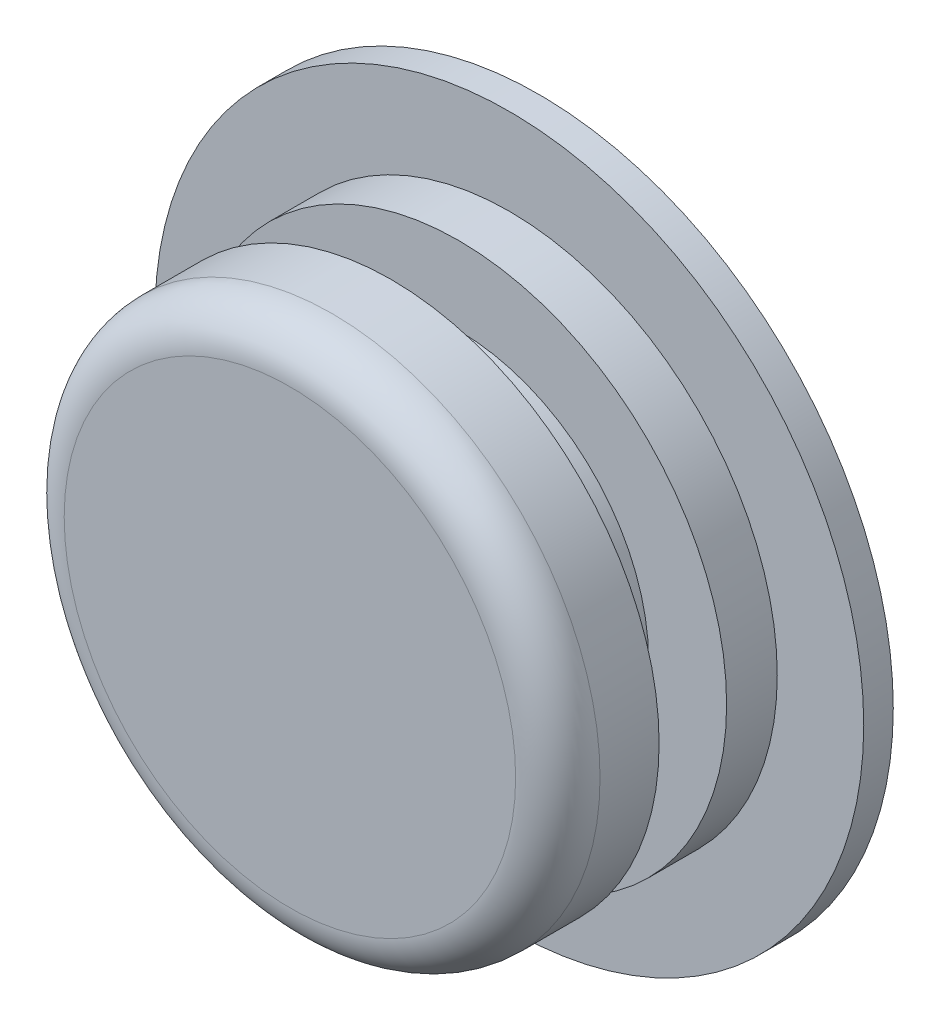
ISO-10303-21;
HEADER;
FILE_DESCRIPTION(('STEP AP214'),'2;1');
FILE_NAME('part.step','',(''),(''),'','','');
FILE_SCHEMA(('AUTOMOTIVE_DESIGN { 1 0 10303 214 1 1 1 1 }'));
ENDSEC;
DATA;
#1=APPLICATION_CONTEXT('core data for automotive mechanical design processes');
#2=APPLICATION_PROTOCOL_DEFINITION('international standard','automotive_design',2000,#1);
#3=PRODUCT_CONTEXT('',#1,'mechanical');
#4=PRODUCT('Part','Part','',(#3));
#5=PRODUCT_RELATED_PRODUCT_CATEGORY('part','',(#4));
#6=PRODUCT_DEFINITION_FORMATION('','',#4);
#7=PRODUCT_DEFINITION_CONTEXT('part definition',#1,'design');
#8=PRODUCT_DEFINITION('design','',#6,#7);
#9=PRODUCT_DEFINITION_SHAPE('','',#8);
#10=(LENGTH_UNIT() NAMED_UNIT(*) SI_UNIT(.MILLI.,.METRE.));
#11=(NAMED_UNIT(*) PLANE_ANGLE_UNIT() SI_UNIT($,.RADIAN.));
#12=(NAMED_UNIT(*) SI_UNIT($,.STERADIAN.) SOLID_ANGLE_UNIT());
#13=UNCERTAINTY_MEASURE_WITH_UNIT(LENGTH_MEASURE(1.E-05),#10,'distance_accuracy_value','');
#14=(GEOMETRIC_REPRESENTATION_CONTEXT(3) GLOBAL_UNCERTAINTY_ASSIGNED_CONTEXT((#13)) GLOBAL_UNIT_ASSIGNED_CONTEXT((#10,
#11,#12)) REPRESENTATION_CONTEXT('',''));
#15=CARTESIAN_POINT('',(0.,0.,0.));
#16=DIRECTION('',(0.,0.,1.));
#17=DIRECTION('',(1.,0.,0.));
#18=AXIS2_PLACEMENT_3D('',#15,#16,#17);
#19=CARTESIAN_POINT('',(0.,0.,29.5));
#20=DIRECTION('',(0.,0.,-1.));
#21=DIRECTION('',(-1.,0.,0.));
#22=AXIS2_PLACEMENT_3D('',#19,#20,#21);
#23=CYLINDRICAL_SURFACE('',#22,31.75);
#24=CARTESIAN_POINT('',(0.,0.,24.5));
#25=DIRECTION('',(0.,0.,1.));
#26=DIRECTION('',(1.,0.,0.));
#27=AXIS2_PLACEMENT_3D('',#24,#25,#26);
#28=CIRCLE('',#27,31.75);
#29=CARTESIAN_POINT('',(31.75,0.,24.5));
#30=VERTEX_POINT('',#29);
#31=EDGE_CURVE('E11',#30,#30,#28,.F.);
#32=ORIENTED_EDGE('',*,*,#31,.T.);
#33=EDGE_LOOP('',(#32));
#34=FACE_BOUND('',#33,.T.);
#35=CARTESIAN_POINT('',(0.,0.,17.5));
#36=DIRECTION('',(0.,0.,1.));
#37=DIRECTION('',(1.,0.,0.));
#38=AXIS2_PLACEMENT_3D('',#35,#36,#37);
#39=CIRCLE('',#38,31.75);
#40=CARTESIAN_POINT('',(31.75,0.,17.5));
#41=VERTEX_POINT('',#40);
#42=EDGE_CURVE('E53',#41,#41,#39,.T.);
#43=ORIENTED_EDGE('',*,*,#42,.T.);
#44=EDGE_LOOP('',(#43));
#45=FACE_BOUND('',#44,.T.);
#46=ADVANCED_FACE('F42',(#34,#45),#23,.T.);
#47=CARTESIAN_POINT('',(0.,0.,29.5));
#48=DIRECTION('',(0.,0.,1.));
#49=DIRECTION('',(1.,0.,0.));
#50=AXIS2_PLACEMENT_3D('',#47,#48,#49);
#51=PLANE('',#50);
#52=CARTESIAN_POINT('',(0.,0.,29.5));
#53=DIRECTION('',(0.,0.,1.));
#54=DIRECTION('',(1.,0.,0.));
#55=AXIS2_PLACEMENT_3D('',#52,#53,#54);
#56=CIRCLE('',#55,26.75);
#57=CARTESIAN_POINT('',(26.75,0.,29.5));
#58=VERTEX_POINT('',#57);
#59=EDGE_CURVE('E49',#58,#58,#56,.T.);
#60=ORIENTED_EDGE('',*,*,#59,.T.);
#61=EDGE_LOOP('',(#60));
#62=FACE_BOUND('',#61,.T.);
#63=ADVANCED_FACE('F63',(#62),#51,.T.);
#64=CARTESIAN_POINT('',(0.,0.,17.5));
#65=DIRECTION('',(0.,0.,1.));
#66=DIRECTION('',(1.,0.,0.));
#67=AXIS2_PLACEMENT_3D('',#64,#65,#66);
#68=PLANE('',#67);
#69=ORIENTED_EDGE('',*,*,#42,.F.);
#70=EDGE_LOOP('',(#69));
#71=FACE_BOUND('',#70,.T.);
#72=ADVANCED_FACE('F61',(#71),#68,.F.);
#73=CARTESIAN_POINT('',(0.,0.,24.5));
#74=DIRECTION('',(0.,0.,1.));
#75=DIRECTION('',(1.,0.,0.));
#76=AXIS2_PLACEMENT_3D('',#73,#74,#75);
#77=TOROIDAL_SURFACE('',#76,26.75,5.);
#78=ORIENTED_EDGE('',*,*,#31,.F.);
#79=EDGE_LOOP('',(#78));
#80=FACE_BOUND('',#79,.T.);
#81=ORIENTED_EDGE('',*,*,#59,.F.);
#82=EDGE_LOOP('',(#81));
#83=FACE_BOUND('',#82,.T.);
#84=ADVANCED_FACE('F44',(#80,#83),#77,.T.);
#85=CLOSED_SHELL('',(#46,#63,#72,#84));
#86=MANIFOLD_SOLID_BREP('B2',#85);
#87=CARTESIAN_POINT('',(0.,0.,3.5));
#88=DIRECTION('',(0.,0.,-1.));
#89=DIRECTION('',(-1.,0.,0.));
#90=AXIS2_PLACEMENT_3D('',#87,#88,#89);
#91=CYLINDRICAL_SURFACE('',#90,42.);
#92=CARTESIAN_POINT('',(0.,0.,3.5));
#93=DIRECTION('',(0.,0.,1.));
#94=DIRECTION('',(1.,0.,0.));
#95=AXIS2_PLACEMENT_3D('',#92,#93,#94);
#96=CIRCLE('',#95,42.);
#97=CARTESIAN_POINT('',(42.,0.,3.5));
#98=VERTEX_POINT('',#97);
#99=EDGE_CURVE('E109',#98,#98,#96,.T.);
#100=ORIENTED_EDGE('',*,*,#99,.F.);
#101=EDGE_LOOP('',(#100));
#102=FACE_BOUND('',#101,.T.);
#103=CARTESIAN_POINT('',(0.,0.,0.));
#104=DIRECTION('',(0.,0.,1.));
#105=DIRECTION('',(1.,0.,0.));
#106=AXIS2_PLACEMENT_3D('',#103,#104,#105);
#107=CIRCLE('',#106,42.);
#108=CARTESIAN_POINT('',(42.,0.,0.));
#109=VERTEX_POINT('',#108);
#110=EDGE_CURVE('E100',#109,#109,#107,.T.);
#111=ORIENTED_EDGE('',*,*,#110,.T.);
#112=EDGE_LOOP('',(#111));
#113=FACE_BOUND('',#112,.T.);
#114=ADVANCED_FACE('F97',(#102,#113),#91,.T.);
#115=CARTESIAN_POINT('',(0.,0.,3.5));
#116=DIRECTION('',(0.,0.,1.));
#117=DIRECTION('',(1.,0.,0.));
#118=AXIS2_PLACEMENT_3D('',#115,#116,#117);
#119=PLANE('',#118);
#120=CARTESIAN_POINT('',(0.,0.,3.5));
#121=DIRECTION('',(0.,0.,1.));
#122=DIRECTION('',(1.,0.,0.));
#123=AXIS2_PLACEMENT_3D('',#120,#121,#122);
#124=CIRCLE('',#123,31.75);
#125=CARTESIAN_POINT('',(31.75,0.,3.5));
#126=VERTEX_POINT('',#125);
#127=EDGE_CURVE('E104',#126,#126,#124,.T.);
#128=ORIENTED_EDGE('',*,*,#127,.F.);
#129=EDGE_LOOP('',(#128));
#130=FACE_BOUND('',#129,.T.);
#131=ORIENTED_EDGE('',*,*,#99,.T.);
#132=EDGE_LOOP('',(#131));
#133=FACE_BOUND('',#132,.T.);
#134=ADVANCED_FACE('F126',(#130,#133),#119,.T.);
#135=CARTESIAN_POINT('',(0.,0.,0.));
#136=DIRECTION('',(0.,0.,1.));
#137=DIRECTION('',(1.,0.,0.));
#138=AXIS2_PLACEMENT_3D('',#135,#136,#137);
#139=PLANE('',#138);
#140=ORIENTED_EDGE('',*,*,#110,.F.);
#141=EDGE_LOOP('',(#140));
#142=FACE_BOUND('',#141,.T.);
#143=ADVANCED_FACE('F123',(#142),#139,.F.);
#144=CARTESIAN_POINT('',(0.,0.,9.5));
#145=DIRECTION('',(0.,0.,-1.));
#146=DIRECTION('',(-1.,0.,0.));
#147=AXIS2_PLACEMENT_3D('',#144,#145,#146);
#148=CYLINDRICAL_SURFACE('',#147,31.75);
#149=CARTESIAN_POINT('',(0.,0.,9.5));
#150=DIRECTION('',(0.,0.,1.));
#151=DIRECTION('',(1.,0.,0.));
#152=AXIS2_PLACEMENT_3D('',#149,#150,#151);
#153=CIRCLE('',#152,31.75);
#154=CARTESIAN_POINT('',(31.75,0.,9.5));
#155=VERTEX_POINT('',#154);
#156=EDGE_CURVE('E114',#155,#155,#153,.T.);
#157=ORIENTED_EDGE('',*,*,#156,.F.);
#158=EDGE_LOOP('',(#157));
#159=FACE_BOUND('',#158,.T.);
#160=ORIENTED_EDGE('',*,*,#127,.T.);
#161=EDGE_LOOP('',(#160));
#162=FACE_BOUND('',#161,.T.);
#163=ADVANCED_FACE('F125',(#159,#162),#148,.T.);
#164=CARTESIAN_POINT('',(0.,0.,9.5));
#165=DIRECTION('',(0.,0.,1.));
#166=DIRECTION('',(1.,0.,0.));
#167=AXIS2_PLACEMENT_3D('',#164,#165,#166);
#168=PLANE('',#167);
#169=CARTESIAN_POINT('',(0.,0.,9.5));
#170=DIRECTION('',(0.,0.,1.));
#171=DIRECTION('',(1.,0.,0.));
#172=AXIS2_PLACEMENT_3D('',#169,#170,#171);
#173=CIRCLE('',#172,22.5);
#174=CARTESIAN_POINT('',(22.5,0.,9.5));
#175=VERTEX_POINT('',#174);
#176=EDGE_CURVE('E41',#175,#175,#173,.T.);
#177=ORIENTED_EDGE('',*,*,#176,.F.);
#178=EDGE_LOOP('',(#177));
#179=FACE_BOUND('',#178,.T.);
#180=ORIENTED_EDGE('',*,*,#156,.T.);
#181=EDGE_LOOP('',(#180));
#182=FACE_BOUND('',#181,.T.);
#183=ADVANCED_FACE('F131',(#179,#182),#168,.T.);
#184=CARTESIAN_POINT('',(0.,0.,17.5));
#185=DIRECTION('',(0.,0.,-1.));
#186=DIRECTION('',(-1.,0.,0.));
#187=AXIS2_PLACEMENT_3D('',#184,#185,#186);
#188=CYLINDRICAL_SURFACE('',#187,22.5);
#189=CARTESIAN_POINT('',(0.,0.,17.5));
#190=DIRECTION('',(0.,0.,1.));
#191=DIRECTION('',(1.,0.,0.));
#192=AXIS2_PLACEMENT_3D('',#189,#190,#191);
#193=CIRCLE('',#192,22.5);
#194=CARTESIAN_POINT('',(22.5,0.,17.5));
#195=VERTEX_POINT('',#194);
#196=EDGE_CURVE('E113',#195,#195,#193,.T.);
#197=ORIENTED_EDGE('',*,*,#196,.F.);
#198=EDGE_LOOP('',(#197));
#199=FACE_BOUND('',#198,.T.);
#200=ORIENTED_EDGE('',*,*,#176,.T.);
#201=EDGE_LOOP('',(#200));
#202=FACE_BOUND('',#201,.T.);
#203=ADVANCED_FACE('F161',(#199,#202),#188,.T.);
#204=CARTESIAN_POINT('',(0.,0.,17.5));
#205=DIRECTION('',(0.,0.,1.));
#206=DIRECTION('',(1.,0.,0.));
#207=AXIS2_PLACEMENT_3D('',#204,#205,#206);
#208=PLANE('',#207);
#209=ORIENTED_EDGE('',*,*,#196,.T.);
#210=EDGE_LOOP('',(#209));
#211=FACE_BOUND('',#210,.T.);
#212=ADVANCED_FACE('F171',(#211),#208,.T.);
#213=CLOSED_SHELL('',(#114,#134,#143,#163,#183,#203,#212));
#214=MANIFOLD_SOLID_BREP('B6',#213);
#215=ADVANCED_BREP_SHAPE_REPRESENTATION('',(#18,#86,#214),#14);
#216=SHAPE_DEFINITION_REPRESENTATION(#9,#215);
ENDSEC;
END-ISO-10303-21;
